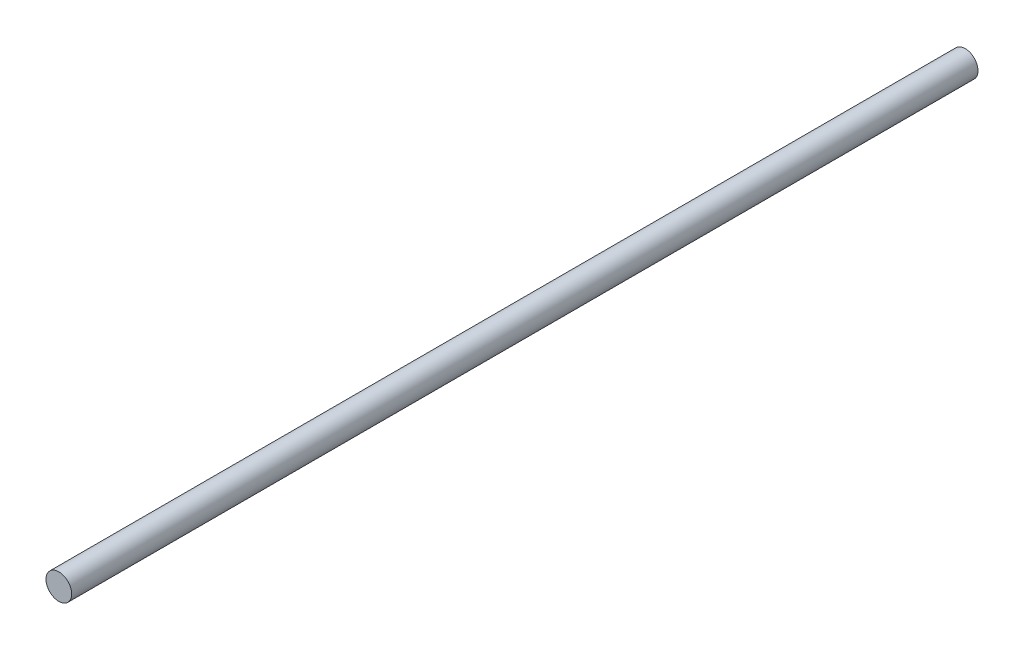
ISO-10303-21;
HEADER;
FILE_DESCRIPTION(('STEP AP214'),'2;1');
FILE_NAME('part.step','',(''),(''),'','','');
FILE_SCHEMA(('AUTOMOTIVE_DESIGN { 1 0 10303 214 1 1 1 1 }'));
ENDSEC;
DATA;
#1=APPLICATION_CONTEXT('core data for automotive mechanical design processes');
#2=APPLICATION_PROTOCOL_DEFINITION('international standard','automotive_design',2000,#1);
#3=PRODUCT_CONTEXT('',#1,'mechanical');
#4=PRODUCT('Part','Part','',(#3));
#5=PRODUCT_RELATED_PRODUCT_CATEGORY('part','',(#4));
#6=PRODUCT_DEFINITION_FORMATION('','',#4);
#7=PRODUCT_DEFINITION_CONTEXT('part definition',#1,'design');
#8=PRODUCT_DEFINITION('design','',#6,#7);
#9=PRODUCT_DEFINITION_SHAPE('','',#8);
#10=(LENGTH_UNIT() NAMED_UNIT(*) SI_UNIT(.MILLI.,.METRE.));
#11=(NAMED_UNIT(*) PLANE_ANGLE_UNIT() SI_UNIT($,.RADIAN.));
#12=(NAMED_UNIT(*) SI_UNIT($,.STERADIAN.) SOLID_ANGLE_UNIT());
#13=UNCERTAINTY_MEASURE_WITH_UNIT(LENGTH_MEASURE(1.E-05),#10,'distance_accuracy_value','');
#14=(GEOMETRIC_REPRESENTATION_CONTEXT(3) GLOBAL_UNCERTAINTY_ASSIGNED_CONTEXT((#13)) GLOBAL_UNIT_ASSIGNED_CONTEXT((#10,
#11,#12)) REPRESENTATION_CONTEXT('',''));
#15=CARTESIAN_POINT('',(0.,0.,0.));
#16=DIRECTION('',(0.,0.,1.));
#17=DIRECTION('',(1.,0.,0.));
#18=AXIS2_PLACEMENT_3D('',#15,#16,#17);
#19=CARTESIAN_POINT('',(0.,0.,120.));
#20=DIRECTION('',(0.,0.,-1.));
#21=DIRECTION('',(-1.,0.,0.));
#22=AXIS2_PLACEMENT_3D('',#19,#20,#21);
#23=CYLINDRICAL_SURFACE('',#22,1.7);
#24=CARTESIAN_POINT('',(0.,0.,120.));
#25=DIRECTION('',(0.,0.,1.));
#26=DIRECTION('',(1.,0.,0.));
#27=AXIS2_PLACEMENT_3D('',#24,#25,#26);
#28=CIRCLE('',#27,1.7);
#29=CARTESIAN_POINT('',(1.7,0.,120.));
#30=VERTEX_POINT('',#29);
#31=EDGE_CURVE('E10',#30,#30,#28,.T.);
#32=ORIENTED_EDGE('',*,*,#31,.F.);
#33=EDGE_LOOP('',(#32));
#34=FACE_BOUND('',#33,.T.);
#35=CARTESIAN_POINT('',(0.,0.,0.));
#36=DIRECTION('',(0.,0.,1.));
#37=DIRECTION('',(1.,0.,0.));
#38=AXIS2_PLACEMENT_3D('',#35,#36,#37);
#39=CIRCLE('',#38,1.7);
#40=CARTESIAN_POINT('',(1.7,0.,0.));
#41=VERTEX_POINT('',#40);
#42=EDGE_CURVE('E40',#41,#41,#39,.T.);
#43=ORIENTED_EDGE('',*,*,#42,.T.);
#44=EDGE_LOOP('',(#43));
#45=FACE_BOUND('',#44,.T.);
#46=ADVANCED_FACE('F37',(#34,#45),#23,.T.);
#47=CARTESIAN_POINT('',(0.,0.,120.));
#48=DIRECTION('',(0.,0.,1.));
#49=DIRECTION('',(1.,0.,0.));
#50=AXIS2_PLACEMENT_3D('',#47,#48,#49);
#51=PLANE('',#50);
#52=ORIENTED_EDGE('',*,*,#31,.T.);
#53=EDGE_LOOP('',(#52));
#54=FACE_BOUND('',#53,.T.);
#55=ADVANCED_FACE('F54',(#54),#51,.T.);
#56=CARTESIAN_POINT('',(0.,0.,0.));
#57=DIRECTION('',(0.,0.,1.));
#58=DIRECTION('',(1.,0.,0.));
#59=AXIS2_PLACEMENT_3D('',#56,#57,#58);
#60=PLANE('',#59);
#61=ORIENTED_EDGE('',*,*,#42,.F.);
#62=EDGE_LOOP('',(#61));
#63=FACE_BOUND('',#62,.T.);
#64=ADVANCED_FACE('F52',(#63),#60,.F.);
#65=CLOSED_SHELL('',(#46,#55,#64));
#66=MANIFOLD_SOLID_BREP('B2',#65);
#67=ADVANCED_BREP_SHAPE_REPRESENTATION('',(#18,#66),#14);
#68=SHAPE_DEFINITION_REPRESENTATION(#9,#67);
ENDSEC;
END-ISO-10303-21;
